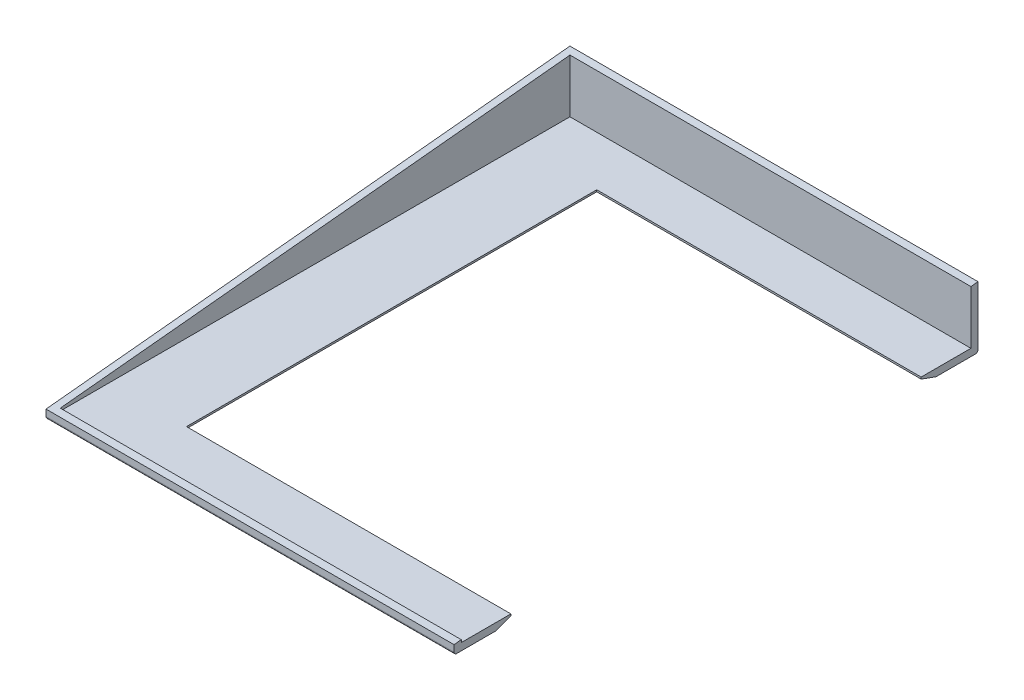
ISO-10303-21;
HEADER;
FILE_DESCRIPTION(('STEP AP214'),'2;1');
FILE_NAME('part.step','',(''),(''),'','','');
FILE_SCHEMA(('AUTOMOTIVE_DESIGN { 1 0 10303 214 1 1 1 1 }'));
ENDSEC;
DATA;
#1=APPLICATION_CONTEXT('core data for automotive mechanical design processes');
#2=APPLICATION_PROTOCOL_DEFINITION('international standard','automotive_design',2000,#1);
#3=PRODUCT_CONTEXT('',#1,'mechanical');
#4=PRODUCT('Part','Part','',(#3));
#5=PRODUCT_RELATED_PRODUCT_CATEGORY('part','',(#4));
#6=PRODUCT_DEFINITION_FORMATION('','',#4);
#7=PRODUCT_DEFINITION_CONTEXT('part definition',#1,'design');
#8=PRODUCT_DEFINITION('design','',#6,#7);
#9=PRODUCT_DEFINITION_SHAPE('','',#8);
#10=(LENGTH_UNIT() NAMED_UNIT(*) SI_UNIT(.MILLI.,.METRE.));
#11=(NAMED_UNIT(*) PLANE_ANGLE_UNIT() SI_UNIT($,.RADIAN.));
#12=(NAMED_UNIT(*) SI_UNIT($,.STERADIAN.) SOLID_ANGLE_UNIT());
#13=UNCERTAINTY_MEASURE_WITH_UNIT(LENGTH_MEASURE(1.E-05),#10,'distance_accuracy_value','');
#14=(GEOMETRIC_REPRESENTATION_CONTEXT(3) GLOBAL_UNCERTAINTY_ASSIGNED_CONTEXT((#13)) GLOBAL_UNIT_ASSIGNED_CONTEXT((#10,
#11,#12)) REPRESENTATION_CONTEXT('',''));
#15=CARTESIAN_POINT('',(0.,0.,0.));
#16=DIRECTION('',(0.,0.,1.));
#17=DIRECTION('',(1.,0.,0.));
#18=AXIS2_PLACEMENT_3D('',#15,#16,#17);
#19=CARTESIAN_POINT('',(0.,0.,0.));
#20=DIRECTION('',(1.,0.,0.));
#21=DIRECTION('',(0.,0.,-1.));
#22=AXIS2_PLACEMENT_3D('',#19,#20,#21);
#23=PLANE('',#22);
#24=DIRECTION('',(0.,-1.,0.));
#25=VECTOR('',#24,1.);
#26=CARTESIAN_POINT('',(0.,-261.583327885194,-70.7189583673774));
#27=LINE('',#26,#25);
#28=CARTESIAN_POINT('',(0.,16.8383329791763,-70.7189583673774));
#29=VERTEX_POINT('',#28);
#30=CARTESIAN_POINT('',(0.,2.,-70.7189583673774));
#31=VERTEX_POINT('',#30);
#32=EDGE_CURVE('E214',#29,#31,#27,.T.);
#33=ORIENTED_EDGE('',*,*,#32,.T.);
#34=DIRECTION('',(0.,0.,1.));
#35=VECTOR('',#34,1.);
#36=CARTESIAN_POINT('',(0.,2.,0.));
#37=LINE('',#36,#35);
#38=CARTESIAN_POINT('',(0.,2.,-56.905));
#39=VERTEX_POINT('',#38);
#40=EDGE_CURVE('E304',#31,#39,#37,.T.);
#41=ORIENTED_EDGE('',*,*,#40,.T.);
#42=DIRECTION('',(0.,1.,0.));
#43=VECTOR('',#42,1.);
#44=CARTESIAN_POINT('',(0.,2.,-56.905));
#45=LINE('',#44,#43);
#46=CARTESIAN_POINT('',(0.,1.50000000000002,-56.905));
#47=VERTEX_POINT('',#46);
#48=EDGE_CURVE('E298',#47,#39,#45,.T.);
#49=ORIENTED_EDGE('',*,*,#48,.F.);
#50=DIRECTION('',(0.,-0.342020143325668,-0.939692620785909));
#51=VECTOR('',#50,1.);
#52=CARTESIAN_POINT('',(0.,0.,-61.026216129182));
#53=LINE('',#52,#51);
#54=CARTESIAN_POINT('',(0.,0.,-61.026216129182));
#55=VERTEX_POINT('',#54);
#56=EDGE_CURVE('E288',#55,#47,#53,.F.);
#57=ORIENTED_EDGE('',*,*,#56,.F.);
#58=DIRECTION('',(0.,0.,1.));
#59=VECTOR('',#58,1.);
#60=CARTESIAN_POINT('',(0.,0.,0.));
#61=LINE('',#60,#59);
#62=CARTESIAN_POINT('',(0.,0.,-71.9793647422029));
#63=VERTEX_POINT('',#62);
#64=EDGE_CURVE('E301',#63,#55,#61,.T.);
#65=ORIENTED_EDGE('',*,*,#64,.F.);
#66=CARTESIAN_POINT('',(0.,0.7,-71.9793647422029));
#67=DIRECTION('',(1.,0.,0.));
#68=DIRECTION('',(0.,0.,-1.));
#69=AXIS2_PLACEMENT_3D('',#66,#67,#68);
#70=CIRCLE('',#69,0.7);
#71=CARTESIAN_POINT('',(0.,0.7,-72.6793647422029));
#72=VERTEX_POINT('',#71);
#73=EDGE_CURVE('E286',#72,#63,#70,.F.);
#74=ORIENTED_EDGE('',*,*,#73,.F.);
#75=DIRECTION('',(0.,-1.,0.));
#76=VECTOR('',#75,1.);
#77=CARTESIAN_POINT('',(0.,0.,-72.6793647422029));
#78=LINE('',#77,#76);
#79=CARTESIAN_POINT('',(0.,17.0343531192115,-72.6793647422029));
#80=VERTEX_POINT('',#79);
#81=EDGE_CURVE('E224',#80,#72,#78,.T.);
#82=ORIENTED_EDGE('',*,*,#81,.F.);
#83=DIRECTION('',(0.,-0.0994934181893851,0.995038220239299));
#84=VECTOR('',#83,1.);
#85=CARTESIAN_POINT('',(0.,9.67049186230395,0.966948074338153));
#86=LINE('',#85,#84);
#87=EDGE_CURVE('E206',#80,#29,#86,.T.);
#88=ORIENTED_EDGE('',*,*,#87,.T.);
#89=EDGE_LOOP('',(#33,#41,#49,#57,#65,#74,#82,#88));
#90=FACE_BOUND('',#89,.T.);
#91=ADVANCED_FACE('F89',(#90),#23,.T.);
#92=DIRECTION('',(0.,-1.,0.));
#93=VECTOR('',#92,1.);
#94=CARTESIAN_POINT('',(0.,2.,56.905));
#95=LINE('',#94,#93);
#96=CARTESIAN_POINT('',(0.,2.,56.905));
#97=VERTEX_POINT('',#96);
#98=CARTESIAN_POINT('',(0.,1.50000000000002,56.905));
#99=VERTEX_POINT('',#98);
#100=EDGE_CURVE('E295',#97,#99,#95,.T.);
#101=ORIENTED_EDGE('',*,*,#100,.F.);
#102=CARTESIAN_POINT('',(0.,2.,70.6793647422029));
#103=VERTEX_POINT('',#102);
#104=EDGE_CURVE('E219',#97,#103,#37,.T.);
#105=ORIENTED_EDGE('',*,*,#104,.T.);
#106=DIRECTION('',(0.,1.,0.));
#107=VECTOR('',#106,1.);
#108=CARTESIAN_POINT('',(0.,-261.583327885194,70.6793647422029));
#109=LINE('',#108,#107);
#110=CARTESIAN_POINT('',(0.,2.699979088573,70.6793647422029));
#111=VERTEX_POINT('',#110);
#112=EDGE_CURVE('E220',#103,#111,#109,.T.);
#113=ORIENTED_EDGE('',*,*,#112,.T.);
#114=CARTESIAN_POINT('',(0.,2.5,72.6793647422029));
#115=VERTEX_POINT('',#114);
#116=EDGE_CURVE('E225',#111,#115,#86,.T.);
#117=ORIENTED_EDGE('',*,*,#116,.T.);
#118=DIRECTION('',(0.,1.,0.));
#119=VECTOR('',#118,1.);
#120=CARTESIAN_POINT('',(0.,0.,72.6793647422029));
#121=LINE('',#120,#119);
#122=CARTESIAN_POINT('',(0.,0.7,72.6793647422029));
#123=VERTEX_POINT('',#122);
#124=EDGE_CURVE('E292',#123,#115,#121,.T.);
#125=ORIENTED_EDGE('',*,*,#124,.F.);
#126=CARTESIAN_POINT('',(0.,0.7,71.9793647422029));
#127=DIRECTION('',(1.,0.,0.));
#128=DIRECTION('',(0.,0.,-1.));
#129=AXIS2_PLACEMENT_3D('',#126,#127,#128);
#130=CIRCLE('',#129,0.7);
#131=CARTESIAN_POINT('',(0.,0.,71.9793647422029));
#132=VERTEX_POINT('',#131);
#133=EDGE_CURVE('E234',#132,#123,#130,.F.);
#134=ORIENTED_EDGE('',*,*,#133,.F.);
#135=CARTESIAN_POINT('',(0.,0.,61.026216129182));
#136=VERTEX_POINT('',#135);
#137=EDGE_CURVE('E300',#136,#132,#61,.T.);
#138=ORIENTED_EDGE('',*,*,#137,.F.);
#139=DIRECTION('',(0.,0.342020143325668,-0.939692620785909));
#140=VECTOR('',#139,1.);
#141=CARTESIAN_POINT('',(0.,0.,61.026216129182));
#142=LINE('',#141,#140);
#143=EDGE_CURVE('E290',#99,#136,#142,.F.);
#144=ORIENTED_EDGE('',*,*,#143,.F.);
#145=EDGE_LOOP('',(#101,#105,#113,#117,#125,#134,#138,#144));
#146=FACE_BOUND('',#145,.T.);
#147=ADVANCED_FACE('F343',(#146),#23,.T.);
#148=CARTESIAN_POINT('',(-90.,2.,56.905));
#149=DIRECTION('',(1.,0.,0.));
#150=DIRECTION('',(0.,0.,-1.));
#151=AXIS2_PLACEMENT_3D('',#148,#149,#150);
#152=PLANE('',#151);
#153=DIRECTION('',(0.,-1.,0.));
#154=VECTOR('',#153,1.);
#155=CARTESIAN_POINT('',(-90.,2.,56.905));
#156=LINE('',#155,#154);
#157=CARTESIAN_POINT('',(-90.,2.,56.905));
#158=VERTEX_POINT('',#157);
#159=CARTESIAN_POINT('',(-90.,1.50000000000002,56.905));
#160=VERTEX_POINT('',#159);
#161=EDGE_CURVE('E261',#158,#160,#156,.T.);
#162=ORIENTED_EDGE('',*,*,#161,.T.);
#163=DIRECTION('',(0.,0.,-1.));
#164=VECTOR('',#163,1.);
#165=CARTESIAN_POINT('',(-90.,1.50000000000002,56.905));
#166=LINE('',#165,#164);
#167=CARTESIAN_POINT('',(-90.,1.50000000000002,-56.905));
#168=VERTEX_POINT('',#167);
#169=EDGE_CURVE('E246',#160,#168,#166,.T.);
#170=ORIENTED_EDGE('',*,*,#169,.T.);
#171=DIRECTION('',(0.,-1.,0.));
#172=VECTOR('',#171,1.);
#173=CARTESIAN_POINT('',(-90.,2.,-56.905));
#174=LINE('',#173,#172);
#175=CARTESIAN_POINT('',(-90.,2.,-56.905));
#176=VERTEX_POINT('',#175);
#177=EDGE_CURVE('E256',#176,#168,#174,.T.);
#178=ORIENTED_EDGE('',*,*,#177,.F.);
#179=DIRECTION('',(0.,0.,1.));
#180=VECTOR('',#179,1.);
#181=CARTESIAN_POINT('',(-90.,2.,56.905));
#182=LINE('',#181,#180);
#183=EDGE_CURVE('E260',#176,#158,#182,.T.);
#184=ORIENTED_EDGE('',*,*,#183,.T.);
#185=EDGE_LOOP('',(#162,#170,#178,#184));
#186=FACE_BOUND('',#185,.T.);
#187=ADVANCED_FACE('F323',(#186),#152,.T.);
#188=CARTESIAN_POINT('',(0.,2.,0.));
#189=DIRECTION('',(0.,-1.,0.));
#190=DIRECTION('',(0.,0.,-1.));
#191=AXIS2_PLACEMENT_3D('',#188,#189,#190);
#192=PLANE('',#191);
#193=ORIENTED_EDGE('',*,*,#40,.F.);
#194=DIRECTION('',(-1.,0.,0.));
#195=VECTOR('',#194,1.);
#196=CARTESIAN_POINT('',(-111.243316088899,2.,-70.7189583673774));
#197=LINE('',#196,#195);
#198=CARTESIAN_POINT('',(-111.243316088899,2.,-70.7189583673774));
#199=VERTEX_POINT('',#198);
#200=EDGE_CURVE('E211',#31,#199,#197,.T.);
#201=ORIENTED_EDGE('',*,*,#200,.T.);
#202=DIRECTION('',(0.,0.,1.));
#203=VECTOR('',#202,1.);
#204=CARTESIAN_POINT('',(-111.243316088899,2.,-70.7189583673774));
#205=LINE('',#204,#203);
#206=CARTESIAN_POINT('',(-111.243316088899,2.,70.6793647422029));
#207=VERTEX_POINT('',#206);
#208=EDGE_CURVE('E334',#199,#207,#205,.T.);
#209=ORIENTED_EDGE('',*,*,#208,.T.);
#210=DIRECTION('',(1.,0.,0.));
#211=VECTOR('',#210,1.);
#212=CARTESIAN_POINT('',(-111.243316088899,2.,70.6793647422029));
#213=LINE('',#212,#211);
#214=EDGE_CURVE('E265',#207,#103,#213,.T.);
#215=ORIENTED_EDGE('',*,*,#214,.T.);
#216=ORIENTED_EDGE('',*,*,#104,.F.);
#217=DIRECTION('',(1.,0.,0.));
#218=VECTOR('',#217,1.);
#219=CARTESIAN_POINT('',(-90.,2.,56.905));
#220=LINE('',#219,#218);
#221=EDGE_CURVE('E257',#158,#97,#220,.T.);
#222=ORIENTED_EDGE('',*,*,#221,.F.);
#223=ORIENTED_EDGE('',*,*,#183,.F.);
#224=DIRECTION('',(-1.,0.,0.));
#225=VECTOR('',#224,1.);
#226=CARTESIAN_POINT('',(-90.,2.,-56.905));
#227=LINE('',#226,#225);
#228=EDGE_CURVE('E262',#39,#176,#227,.T.);
#229=ORIENTED_EDGE('',*,*,#228,.F.);
#230=EDGE_LOOP('',(#193,#201,#209,#215,#216,#222,#223,#229));
#231=FACE_BOUND('',#230,.T.);
#232=ADVANCED_FACE('F313',(#231),#192,.F.);
#233=CARTESIAN_POINT('',(-111.243316088899,-261.583327885194,-70.7189583673774));
#234=DIRECTION('',(0.,0.,-1.));
#235=DIRECTION('',(-1.,0.,0.));
#236=AXIS2_PLACEMENT_3D('',#233,#234,#235);
#237=PLANE('',#236);
#238=ORIENTED_EDGE('',*,*,#32,.F.);
#239=DIRECTION('',(-1.,0.,0.));
#240=VECTOR('',#239,1.);
#241=CARTESIAN_POINT('',(-111.243316088899,16.8383329791763,-70.7189583673774));
#242=LINE('',#241,#240);
#243=CARTESIAN_POINT('',(-111.243316088899,16.8383329791763,-70.7189583673774));
#244=VERTEX_POINT('',#243);
#245=EDGE_CURVE('E202',#29,#244,#242,.T.);
#246=ORIENTED_EDGE('',*,*,#245,.T.);
#247=DIRECTION('',(0.,1.,0.));
#248=VECTOR('',#247,1.);
#249=CARTESIAN_POINT('',(-111.243316088899,-261.583327885194,-70.7189583673774));
#250=LINE('',#249,#248);
#251=EDGE_CURVE('E269',#199,#244,#250,.T.);
#252=ORIENTED_EDGE('',*,*,#251,.F.);
#253=ORIENTED_EDGE('',*,*,#200,.F.);
#254=EDGE_LOOP('',(#238,#246,#252,#253));
#255=FACE_BOUND('',#254,.T.);
#256=ADVANCED_FACE('F215',(#255),#237,.F.);
#257=CARTESIAN_POINT('',(-111.243316088899,-261.583327885194,-70.7189583673774));
#258=DIRECTION('',(-1.,0.,0.));
#259=DIRECTION('',(0.,0.,1.));
#260=AXIS2_PLACEMENT_3D('',#257,#258,#259);
#261=PLANE('',#260);
#262=ORIENTED_EDGE('',*,*,#251,.T.);
#263=DIRECTION('',(0.,-0.0994934181893851,0.995038220239299));
#264=VECTOR('',#263,1.);
#265=CARTESIAN_POINT('',(-111.243316088899,14.0822535903524,-43.1552825001623));
#266=LINE('',#265,#264);
#267=CARTESIAN_POINT('',(-111.243316088899,2.699979088573,70.6793647422029));
#268=VERTEX_POINT('',#267);
#269=EDGE_CURVE('E207',#244,#268,#266,.T.);
#270=ORIENTED_EDGE('',*,*,#269,.T.);
#271=DIRECTION('',(0.,1.,0.));
#272=VECTOR('',#271,1.);
#273=CARTESIAN_POINT('',(-111.243316088899,-261.583327885194,70.6793647422029));
#274=LINE('',#273,#272);
#275=EDGE_CURVE('E267',#207,#268,#274,.T.);
#276=ORIENTED_EDGE('',*,*,#275,.F.);
#277=ORIENTED_EDGE('',*,*,#208,.F.);
#278=EDGE_LOOP('',(#262,#270,#276,#277));
#279=FACE_BOUND('',#278,.T.);
#280=ADVANCED_FACE('F340',(#279),#261,.F.);
#281=CARTESIAN_POINT('',(-111.243316088899,-261.583327885194,70.6793647422029));
#282=DIRECTION('',(0.,0.,1.));
#283=DIRECTION('',(1.,0.,0.));
#284=AXIS2_PLACEMENT_3D('',#281,#282,#283);
#285=PLANE('',#284);
#286=ORIENTED_EDGE('',*,*,#112,.F.);
#287=ORIENTED_EDGE('',*,*,#214,.F.);
#288=ORIENTED_EDGE('',*,*,#275,.T.);
#289=DIRECTION('',(1.,0.,0.));
#290=VECTOR('',#289,1.);
#291=CARTESIAN_POINT('',(-111.243316088899,2.699979088573,70.6793647422029));
#292=LINE('',#291,#290);
#293=EDGE_CURVE('E113',#268,#111,#292,.T.);
#294=ORIENTED_EDGE('',*,*,#293,.T.);
#295=EDGE_LOOP('',(#286,#287,#288,#294));
#296=FACE_BOUND('',#295,.T.);
#297=ADVANCED_FACE('F342',(#296),#285,.F.);
#298=CARTESIAN_POINT('',(-113.203722463725,0.,69.6793647422029));
#299=DIRECTION('',(-1.,0.,0.));
#300=DIRECTION('',(0.,0.,1.));
#301=AXIS2_PLACEMENT_3D('',#298,#299,#300);
#302=PLANE('',#301);
#303=DIRECTION('',(0.,1.,0.));
#304=VECTOR('',#303,1.);
#305=CARTESIAN_POINT('',(-113.203722463725,0.,-72.6793647422029));
#306=LINE('',#305,#304);
#307=CARTESIAN_POINT('',(-113.203722463725,0.7,-72.6793647422029));
#308=VERTEX_POINT('',#307);
#309=CARTESIAN_POINT('',(-113.203722463725,17.0343531192115,-72.6793647422029));
#310=VERTEX_POINT('',#309);
#311=EDGE_CURVE('E264',#308,#310,#306,.T.);
#312=ORIENTED_EDGE('',*,*,#311,.F.);
#313=DIRECTION('',(0.,0.,1.));
#314=VECTOR('',#313,1.);
#315=CARTESIAN_POINT('',(-113.203722463725,0.7,69.6793647422029));
#316=LINE('',#315,#314);
#317=CARTESIAN_POINT('',(-113.203722463725,0.7,72.6793647422029));
#318=VERTEX_POINT('',#317);
#319=EDGE_CURVE('E233',#308,#318,#316,.T.);
#320=ORIENTED_EDGE('',*,*,#319,.T.);
#321=DIRECTION('',(0.,1.,0.));
#322=VECTOR('',#321,1.);
#323=CARTESIAN_POINT('',(-113.203722463725,0.,72.6793647422029));
#324=LINE('',#323,#322);
#325=CARTESIAN_POINT('',(-113.203722463725,2.5,72.6793647422029));
#326=VERTEX_POINT('',#325);
#327=EDGE_CURVE('E268',#318,#326,#324,.T.);
#328=ORIENTED_EDGE('',*,*,#327,.T.);
#329=DIRECTION('',(0.,-0.0994934181893852,0.995038220239299));
#330=VECTOR('',#329,1.);
#331=CARTESIAN_POINT('',(-113.203722463725,9.67049186230395,0.966948074338153));
#332=LINE('',#331,#330);
#333=EDGE_CURVE('E271',#310,#326,#332,.T.);
#334=ORIENTED_EDGE('',*,*,#333,.F.);
#335=EDGE_LOOP('',(#312,#320,#328,#334));
#336=FACE_BOUND('',#335,.T.);
#337=ADVANCED_FACE('F403',(#336),#302,.T.);
#338=CARTESIAN_POINT('',(-94.121216129182,0.,0.));
#339=DIRECTION('',(-0.342020143325668,0.939692620785909,0.));
#340=DIRECTION('',(0.,0.,1.));
#341=AXIS2_PLACEMENT_3D('',#338,#339,#340);
#342=PLANE('',#341);
#343=DIRECTION('',(0.684791078771736,0.249243569363954,-0.684791078771736));
#344=VECTOR('',#343,1.);
#345=CARTESIAN_POINT('',(-65.5036542529705,10.4159407002122,32.4086542529705));
#346=LINE('',#345,#344);
#347=CARTESIAN_POINT('',(-94.121216129182,0.,61.026216129182));
#348=VERTEX_POINT('',#347);
#349=EDGE_CURVE('E276',#160,#348,#346,.F.);
#350=ORIENTED_EDGE('',*,*,#349,.T.);
#351=DIRECTION('',(0.,0.,1.));
#352=VECTOR('',#351,1.);
#353=CARTESIAN_POINT('',(-94.121216129182,0.,0.));
#354=LINE('',#353,#352);
#355=CARTESIAN_POINT('',(-94.121216129182,0.,-61.026216129182));
#356=VERTEX_POINT('',#355);
#357=EDGE_CURVE('E252',#356,#348,#354,.T.);
#358=ORIENTED_EDGE('',*,*,#357,.F.);
#359=DIRECTION('',(0.684791078771736,0.249243569363954,0.684791078771736));
#360=VECTOR('',#359,1.);
#361=CARTESIAN_POINT('',(-49.984123953265,16.0645877790974,-16.889123953265));
#362=LINE('',#361,#360);
#363=EDGE_CURVE('E280',#168,#356,#362,.F.);
#364=ORIENTED_EDGE('',*,*,#363,.F.);
#365=ORIENTED_EDGE('',*,*,#169,.F.);
#366=EDGE_LOOP('',(#350,#358,#364,#365));
#367=FACE_BOUND('',#366,.T.);
#368=ADVANCED_FACE('F373',(#367),#342,.F.);
#369=CARTESIAN_POINT('',(-90.,2.,-56.905));
#370=DIRECTION('',(0.,0.,1.));
#371=DIRECTION('',(1.,0.,0.));
#372=AXIS2_PLACEMENT_3D('',#369,#370,#371);
#373=PLANE('',#372);
#374=DIRECTION('',(1.,0.,0.));
#375=VECTOR('',#374,1.);
#376=CARTESIAN_POINT('',(-90.,1.50000000000002,-56.905));
#377=LINE('',#376,#375);
#378=EDGE_CURVE('E247',#168,#47,#377,.T.);
#379=ORIENTED_EDGE('',*,*,#378,.T.);
#380=ORIENTED_EDGE('',*,*,#48,.T.);
#381=ORIENTED_EDGE('',*,*,#228,.T.);
#382=ORIENTED_EDGE('',*,*,#177,.T.);
#383=EDGE_LOOP('',(#379,#380,#381,#382));
#384=FACE_BOUND('',#383,.T.);
#385=ADVANCED_FACE('F319',(#384),#373,.T.);
#386=CARTESIAN_POINT('',(-112.503722463725,0.7,69.6793647422029));
#387=DIRECTION('',(0.,0.,1.));
#388=DIRECTION('',(1.,0.,0.));
#389=AXIS2_PLACEMENT_3D('',#386,#387,#388);
#390=CYLINDRICAL_SURFACE('',#389,0.7);
#391=CARTESIAN_POINT('',(-112.503722463725,0.7,-71.9793647422029));
#392=DIRECTION('',(-0.707106781186547,0.,0.707106781186547));
#393=DIRECTION('',(-0.707106781186547,0.,-0.707106781186547));
#394=AXIS2_PLACEMENT_3D('',#391,#392,#393);
#395=ELLIPSE('',#394,0.989949493661166,0.7);
#396=CARTESIAN_POINT('',(-112.503722463725,0.,-71.9793647422029));
#397=VERTEX_POINT('',#396);
#398=EDGE_CURVE('E98',#308,#397,#395,.T.);
#399=ORIENTED_EDGE('',*,*,#398,.T.);
#400=DIRECTION('',(0.,0.,1.));
#401=VECTOR('',#400,1.);
#402=CARTESIAN_POINT('',(-112.503722463725,0.,0.));
#403=LINE('',#402,#401);
#404=CARTESIAN_POINT('',(-112.503722463725,0.,71.9793647422029));
#405=VERTEX_POINT('',#404);
#406=EDGE_CURVE('E237',#405,#397,#403,.F.);
#407=ORIENTED_EDGE('',*,*,#406,.F.);
#408=CARTESIAN_POINT('',(-112.503722463725,0.7,71.9793647422029));
#409=DIRECTION('',(0.707106781186547,0.,0.707106781186547));
#410=DIRECTION('',(-0.707106781186547,0.,0.707106781186547));
#411=AXIS2_PLACEMENT_3D('',#408,#409,#410);
#412=ELLIPSE('',#411,0.989949493661166,0.7);
#413=EDGE_CURVE('E12',#318,#405,#412,.T.);
#414=ORIENTED_EDGE('',*,*,#413,.F.);
#415=ORIENTED_EDGE('',*,*,#319,.F.);
#416=EDGE_LOOP('',(#399,#407,#414,#415));
#417=FACE_BOUND('',#416,.T.);
#418=ADVANCED_FACE('F359',(#417),#390,.T.);
#419=CARTESIAN_POINT('',(110.203722463725,0.,72.6793647422029));
#420=DIRECTION('',(0.,0.,1.));
#421=DIRECTION('',(1.,0.,0.));
#422=AXIS2_PLACEMENT_3D('',#419,#420,#421);
#423=PLANE('',#422);
#424=DIRECTION('',(1.,0.,0.));
#425=VECTOR('',#424,1.);
#426=CARTESIAN_POINT('',(110.203722463725,0.7,72.6793647422029));
#427=LINE('',#426,#425);
#428=EDGE_CURVE('E241',#318,#123,#427,.T.);
#429=ORIENTED_EDGE('',*,*,#428,.T.);
#430=ORIENTED_EDGE('',*,*,#124,.T.);
#431=DIRECTION('',(-1.,0.,0.));
#432=VECTOR('',#431,1.);
#433=CARTESIAN_POINT('',(259.440380786187,2.5,72.6793647422029));
#434=LINE('',#433,#432);
#435=EDGE_CURVE('E93',#115,#326,#434,.T.);
#436=ORIENTED_EDGE('',*,*,#435,.T.);
#437=ORIENTED_EDGE('',*,*,#327,.F.);
#438=EDGE_LOOP('',(#429,#430,#436,#437));
#439=FACE_BOUND('',#438,.T.);
#440=ADVANCED_FACE('F345',(#439),#423,.T.);
#441=CARTESIAN_POINT('',(0.,0.,0.));
#442=DIRECTION('',(0.,-1.,0.));
#443=DIRECTION('',(0.,0.,-1.));
#444=AXIS2_PLACEMENT_3D('',#441,#442,#443);
#445=PLANE('',#444);
#446=DIRECTION('',(-1.,0.,0.));
#447=VECTOR('',#446,1.);
#448=CARTESIAN_POINT('',(0.,0.,-71.9793647422029));
#449=LINE('',#448,#447);
#450=EDGE_CURVE('E238',#397,#63,#449,.F.);
#451=ORIENTED_EDGE('',*,*,#450,.T.);
#452=ORIENTED_EDGE('',*,*,#64,.T.);
#453=DIRECTION('',(-1.,0.,0.));
#454=VECTOR('',#453,1.);
#455=CARTESIAN_POINT('',(0.,0.,-61.026216129182));
#456=LINE('',#455,#454);
#457=EDGE_CURVE('E250',#55,#356,#456,.T.);
#458=ORIENTED_EDGE('',*,*,#457,.T.);
#459=ORIENTED_EDGE('',*,*,#357,.T.);
#460=DIRECTION('',(1.,0.,0.));
#461=VECTOR('',#460,1.);
#462=CARTESIAN_POINT('',(0.,0.,61.026216129182));
#463=LINE('',#462,#461);
#464=EDGE_CURVE('E253',#348,#136,#463,.T.);
#465=ORIENTED_EDGE('',*,*,#464,.T.);
#466=ORIENTED_EDGE('',*,*,#137,.T.);
#467=DIRECTION('',(1.,0.,0.));
#468=VECTOR('',#467,1.);
#469=CARTESIAN_POINT('',(0.,0.,71.9793647422029));
#470=LINE('',#469,#468);
#471=EDGE_CURVE('E235',#132,#405,#470,.F.);
#472=ORIENTED_EDGE('',*,*,#471,.T.);
#473=ORIENTED_EDGE('',*,*,#406,.T.);
#474=EDGE_LOOP('',(#451,#452,#458,#459,#465,#466,#472,#473));
#475=FACE_BOUND('',#474,.T.);
#476=ADVANCED_FACE('F352',(#475),#445,.T.);
#477=CARTESIAN_POINT('',(110.203722463725,0.7,71.9793647422029));
#478=DIRECTION('',(1.,0.,0.));
#479=DIRECTION('',(0.,0.,-1.));
#480=AXIS2_PLACEMENT_3D('',#477,#478,#479);
#481=CYLINDRICAL_SURFACE('',#480,0.7);
#482=ORIENTED_EDGE('',*,*,#471,.F.);
#483=ORIENTED_EDGE('',*,*,#133,.T.);
#484=ORIENTED_EDGE('',*,*,#428,.F.);
#485=ORIENTED_EDGE('',*,*,#413,.T.);
#486=EDGE_LOOP('',(#482,#483,#484,#485));
#487=FACE_BOUND('',#486,.T.);
#488=ADVANCED_FACE('F91',(#487),#481,.T.);
#489=CARTESIAN_POINT('',(110.203722463725,0.,-72.6793647422029));
#490=DIRECTION('',(0.,0.,-1.));
#491=DIRECTION('',(-1.,0.,0.));
#492=AXIS2_PLACEMENT_3D('',#489,#490,#491);
#493=PLANE('',#492);
#494=DIRECTION('',(-1.,0.,0.));
#495=VECTOR('',#494,1.);
#496=CARTESIAN_POINT('',(259.440380786187,17.0343531192115,-72.6793647422029));
#497=LINE('',#496,#495);
#498=EDGE_CURVE('E106',#80,#310,#497,.T.);
#499=ORIENTED_EDGE('',*,*,#498,.F.);
#500=ORIENTED_EDGE('',*,*,#81,.T.);
#501=DIRECTION('',(-1.,0.,0.));
#502=VECTOR('',#501,1.);
#503=CARTESIAN_POINT('',(110.203722463725,0.7,-72.6793647422029));
#504=LINE('',#503,#502);
#505=EDGE_CURVE('E231',#72,#308,#504,.T.);
#506=ORIENTED_EDGE('',*,*,#505,.T.);
#507=ORIENTED_EDGE('',*,*,#311,.T.);
#508=EDGE_LOOP('',(#499,#500,#506,#507));
#509=FACE_BOUND('',#508,.T.);
#510=ADVANCED_FACE('F499',(#509),#493,.T.);
#511=CARTESIAN_POINT('',(110.203722463725,0.7,-71.9793647422029));
#512=DIRECTION('',(-1.,0.,0.));
#513=DIRECTION('',(0.,0.,1.));
#514=AXIS2_PLACEMENT_3D('',#511,#512,#513);
#515=CYLINDRICAL_SURFACE('',#514,0.7);
#516=ORIENTED_EDGE('',*,*,#505,.F.);
#517=ORIENTED_EDGE('',*,*,#73,.T.);
#518=ORIENTED_EDGE('',*,*,#450,.F.);
#519=ORIENTED_EDGE('',*,*,#398,.F.);
#520=EDGE_LOOP('',(#516,#517,#518,#519));
#521=FACE_BOUND('',#520,.T.);
#522=ADVANCED_FACE('F387',(#521),#515,.T.);
#523=CARTESIAN_POINT('',(0.,0.,-61.026216129182));
#524=DIRECTION('',(0.,0.939692620785909,-0.342020143325668));
#525=DIRECTION('',(-1.,0.,0.));
#526=AXIS2_PLACEMENT_3D('',#523,#524,#525);
#527=PLANE('',#526);
#528=ORIENTED_EDGE('',*,*,#457,.F.);
#529=ORIENTED_EDGE('',*,*,#56,.T.);
#530=ORIENTED_EDGE('',*,*,#378,.F.);
#531=ORIENTED_EDGE('',*,*,#363,.T.);
#532=EDGE_LOOP('',(#528,#529,#530,#531));
#533=FACE_BOUND('',#532,.T.);
#534=ADVANCED_FACE('F371',(#533),#527,.F.);
#535=CARTESIAN_POINT('',(-90.,2.,56.905));
#536=DIRECTION('',(0.,0.,-1.));
#537=DIRECTION('',(-1.,0.,0.));
#538=AXIS2_PLACEMENT_3D('',#535,#536,#537);
#539=PLANE('',#538);
#540=ORIENTED_EDGE('',*,*,#221,.T.);
#541=ORIENTED_EDGE('',*,*,#100,.T.);
#542=DIRECTION('',(-1.,0.,0.));
#543=VECTOR('',#542,1.);
#544=CARTESIAN_POINT('',(-90.,1.50000000000002,56.905));
#545=LINE('',#544,#543);
#546=EDGE_CURVE('E244',#99,#160,#545,.T.);
#547=ORIENTED_EDGE('',*,*,#546,.T.);
#548=ORIENTED_EDGE('',*,*,#161,.F.);
#549=EDGE_LOOP('',(#540,#541,#547,#548));
#550=FACE_BOUND('',#549,.T.);
#551=ADVANCED_FACE('F379',(#550),#539,.T.);
#552=CARTESIAN_POINT('',(0.,0.,61.026216129182));
#553=DIRECTION('',(0.,0.939692620785909,0.342020143325668));
#554=DIRECTION('',(1.,0.,0.));
#555=AXIS2_PLACEMENT_3D('',#552,#553,#554);
#556=PLANE('',#555);
#557=ORIENTED_EDGE('',*,*,#546,.F.);
#558=ORIENTED_EDGE('',*,*,#143,.T.);
#559=ORIENTED_EDGE('',*,*,#464,.F.);
#560=ORIENTED_EDGE('',*,*,#349,.F.);
#561=EDGE_LOOP('',(#557,#558,#559,#560));
#562=FACE_BOUND('',#561,.T.);
#563=ADVANCED_FACE('F377',(#562),#556,.F.);
#564=CARTESIAN_POINT('',(259.440380786187,9.67049186230395,0.966948074338153));
#565=DIRECTION('',(0.,-0.995038220239299,-0.0994934181893851));
#566=DIRECTION('',(0.,0.0994934181893851,-0.995038220239299));
#567=AXIS2_PLACEMENT_3D('',#564,#565,#566);
#568=PLANE('',#567);
#569=ORIENTED_EDGE('',*,*,#87,.F.);
#570=ORIENTED_EDGE('',*,*,#498,.T.);
#571=ORIENTED_EDGE('',*,*,#333,.T.);
#572=ORIENTED_EDGE('',*,*,#435,.F.);
#573=ORIENTED_EDGE('',*,*,#116,.F.);
#574=ORIENTED_EDGE('',*,*,#293,.F.);
#575=ORIENTED_EDGE('',*,*,#269,.F.);
#576=ORIENTED_EDGE('',*,*,#245,.F.);
#577=EDGE_LOOP('',(#569,#570,#571,#572,#573,#574,#575,#576));
#578=FACE_BOUND('',#577,.T.);
#579=ADVANCED_FACE('F204',(#578),#568,.F.);
#580=CLOSED_SHELL('',(#91,#147,#187,#232,#256,#280,#297,#337,#368,#385,#418,#440,#476,#488,#510,
#522,#534,#551,#563,#579));
#581=MANIFOLD_SOLID_BREP('B2',#580);
#582=ADVANCED_BREP_SHAPE_REPRESENTATION('',(#18,#581),#14);
#583=SHAPE_DEFINITION_REPRESENTATION(#9,#582);
ENDSEC;
END-ISO-10303-21;
